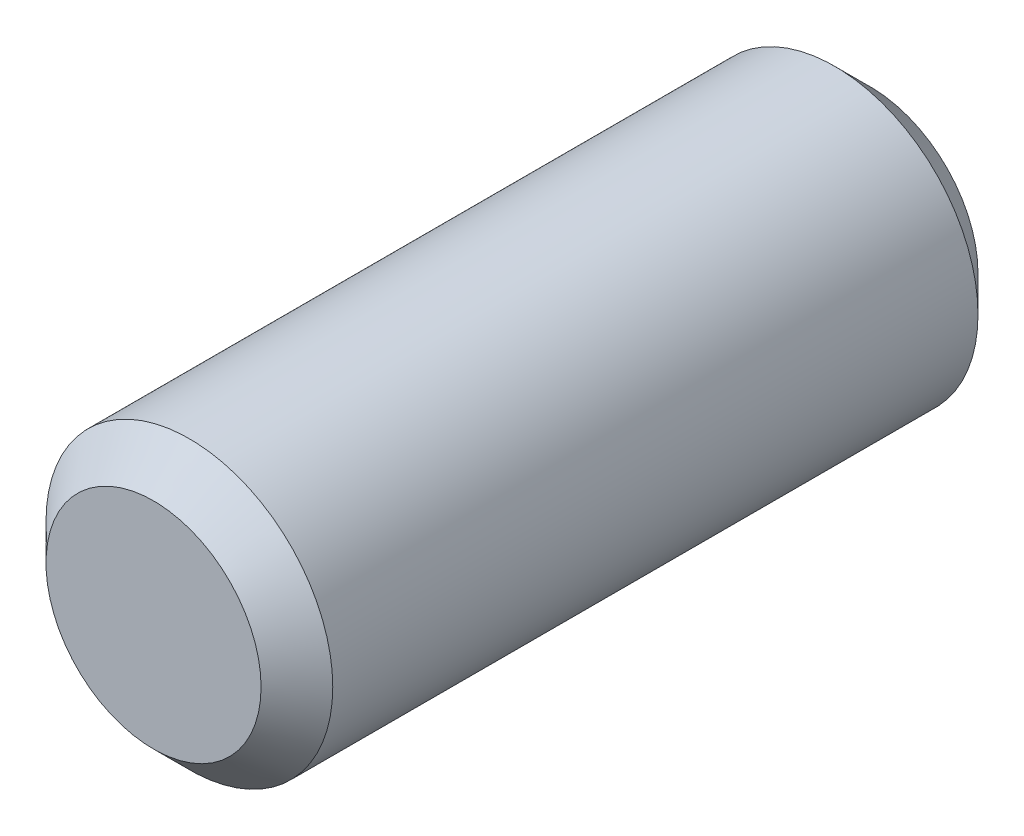
ISO-10303-21;
HEADER;
FILE_DESCRIPTION(('STEP AP214'),'2;1');
FILE_NAME('part.step','',(''),(''),'','','');
FILE_SCHEMA(('AUTOMOTIVE_DESIGN { 1 0 10303 214 1 1 1 1 }'));
ENDSEC;
DATA;
#1=APPLICATION_CONTEXT('core data for automotive mechanical design processes');
#2=APPLICATION_PROTOCOL_DEFINITION('international standard','automotive_design',2000,#1);
#3=PRODUCT_CONTEXT('',#1,'mechanical');
#4=PRODUCT('Part','Part','',(#3));
#5=PRODUCT_RELATED_PRODUCT_CATEGORY('part','',(#4));
#6=PRODUCT_DEFINITION_FORMATION('','',#4);
#7=PRODUCT_DEFINITION_CONTEXT('part definition',#1,'design');
#8=PRODUCT_DEFINITION('design','',#6,#7);
#9=PRODUCT_DEFINITION_SHAPE('','',#8);
#10=(LENGTH_UNIT() NAMED_UNIT(*) SI_UNIT(.MILLI.,.METRE.));
#11=(NAMED_UNIT(*) PLANE_ANGLE_UNIT() SI_UNIT($,.RADIAN.));
#12=(NAMED_UNIT(*) SI_UNIT($,.STERADIAN.) SOLID_ANGLE_UNIT());
#13=UNCERTAINTY_MEASURE_WITH_UNIT(LENGTH_MEASURE(1.E-05),#10,'distance_accuracy_value','');
#14=(GEOMETRIC_REPRESENTATION_CONTEXT(3) GLOBAL_UNCERTAINTY_ASSIGNED_CONTEXT((#13)) GLOBAL_UNIT_ASSIGNED_CONTEXT((#10,
#11,#12)) REPRESENTATION_CONTEXT('',''));
#15=CARTESIAN_POINT('',(0.,0.,0.));
#16=DIRECTION('',(0.,0.,1.));
#17=DIRECTION('',(1.,0.,0.));
#18=AXIS2_PLACEMENT_3D('',#15,#16,#17);
#19=CARTESIAN_POINT('',(208.88140451995,179.873872766802,-31.3137084989848));
#20=DIRECTION('',(0.,0.,1.));
#21=DIRECTION('',(1.,0.,0.));
#22=AXIS2_PLACEMENT_3D('',#19,#20,#21);
#23=CYLINDRICAL_SURFACE('',#22,3.99999999999999);
#24=CARTESIAN_POINT('',(208.88140451995,179.873872766802,-19.));
#25=DIRECTION('',(0.,0.,1.));
#26=DIRECTION('',(1.,0.,0.));
#27=AXIS2_PLACEMENT_3D('',#24,#25,#26);
#28=CIRCLE('',#27,3.99999999999999);
#29=CARTESIAN_POINT('',(212.88140451995,179.873872766802,-19.));
#30=VERTEX_POINT('',#29);
#31=EDGE_CURVE('E37',#30,#30,#28,.T.);
#32=ORIENTED_EDGE('',*,*,#31,.T.);
#33=EDGE_LOOP('',(#32));
#34=FACE_BOUND('',#33,.T.);
#35=CARTESIAN_POINT('',(208.88140451995,179.873872766802,-0.999999999999987));
#36=DIRECTION('',(0.,0.,1.));
#37=DIRECTION('',(1.,0.,0.));
#38=AXIS2_PLACEMENT_3D('',#35,#36,#37);
#39=CIRCLE('',#38,3.99999999999999);
#40=CARTESIAN_POINT('',(212.88140451995,179.873872766802,-0.999999999999987));
#41=VERTEX_POINT('',#40);
#42=EDGE_CURVE('E41',#41,#41,#39,.F.);
#43=ORIENTED_EDGE('',*,*,#42,.T.);
#44=EDGE_LOOP('',(#43));
#45=FACE_BOUND('',#44,.T.);
#46=ADVANCED_FACE('F30',(#34,#45),#23,.T.);
#47=CARTESIAN_POINT('',(208.88140451995,179.873872766802,0.));
#48=DIRECTION('',(0.,0.,1.));
#49=DIRECTION('',(1.,0.,0.));
#50=AXIS2_PLACEMENT_3D('',#47,#48,#49);
#51=PLANE('',#50);
#52=CARTESIAN_POINT('',(208.88140451995,179.873872766802,0.));
#53=DIRECTION('',(0.,0.,1.));
#54=DIRECTION('',(1.,0.,0.));
#55=AXIS2_PLACEMENT_3D('',#52,#53,#54);
#56=CIRCLE('',#55,3.);
#57=CARTESIAN_POINT('',(211.88140451995,179.873872766802,0.));
#58=VERTEX_POINT('',#57);
#59=EDGE_CURVE('E10',#58,#58,#56,.T.);
#60=ORIENTED_EDGE('',*,*,#59,.T.);
#61=EDGE_LOOP('',(#60));
#62=FACE_BOUND('',#61,.T.);
#63=ADVANCED_FACE('F61',(#62),#51,.T.);
#64=CARTESIAN_POINT('',(-29.0717121826814,179.873872766802,-20.));
#65=DIRECTION('',(0.,0.,1.));
#66=DIRECTION('',(1.,0.,0.));
#67=AXIS2_PLACEMENT_3D('',#64,#65,#66);
#68=PLANE('',#67);
#69=CARTESIAN_POINT('',(208.88140451995,179.873872766802,-20.));
#70=DIRECTION('',(0.,0.,1.));
#71=DIRECTION('',(1.,0.,0.));
#72=AXIS2_PLACEMENT_3D('',#69,#70,#71);
#73=CIRCLE('',#72,3.);
#74=CARTESIAN_POINT('',(211.88140451995,179.873872766802,-20.));
#75=VERTEX_POINT('',#74);
#76=EDGE_CURVE('E45',#75,#75,#73,.F.);
#77=ORIENTED_EDGE('',*,*,#76,.T.);
#78=EDGE_LOOP('',(#77));
#79=FACE_BOUND('',#78,.T.);
#80=ADVANCED_FACE('F51',(#79),#68,.F.);
#81=CARTESIAN_POINT('',(208.88140451995,179.873872766802,-20.));
#82=DIRECTION('',(0.,0.,1.));
#83=DIRECTION('',(1.,0.,0.));
#84=AXIS2_PLACEMENT_3D('',#81,#82,#83);
#85=CONICAL_SURFACE('',#84,3.,0.785398163397452);
#86=ORIENTED_EDGE('',*,*,#31,.F.);
#87=EDGE_LOOP('',(#86));
#88=FACE_BOUND('',#87,.T.);
#89=ORIENTED_EDGE('',*,*,#76,.F.);
#90=EDGE_LOOP('',(#89));
#91=FACE_BOUND('',#90,.T.);
#92=ADVANCED_FACE('F53',(#88,#91),#85,.T.);
#93=CARTESIAN_POINT('',(208.88140451995,179.873872766802,0.));
#94=DIRECTION('',(0.,0.,-1.));
#95=DIRECTION('',(-1.,0.,0.));
#96=AXIS2_PLACEMENT_3D('',#93,#94,#95);
#97=CONICAL_SURFACE('',#96,3.,0.78539816339745);
#98=ORIENTED_EDGE('',*,*,#42,.F.);
#99=EDGE_LOOP('',(#98));
#100=FACE_BOUND('',#99,.T.);
#101=ORIENTED_EDGE('',*,*,#59,.F.);
#102=EDGE_LOOP('',(#101));
#103=FACE_BOUND('',#102,.T.);
#104=ADVANCED_FACE('F32',(#100,#103),#97,.T.);
#105=CLOSED_SHELL('',(#46,#63,#80,#92,#104));
#106=MANIFOLD_SOLID_BREP('B2',#105);
#107=ADVANCED_BREP_SHAPE_REPRESENTATION('',(#18,#106),#14);
#108=SHAPE_DEFINITION_REPRESENTATION(#9,#107);
ENDSEC;
END-ISO-10303-21;
